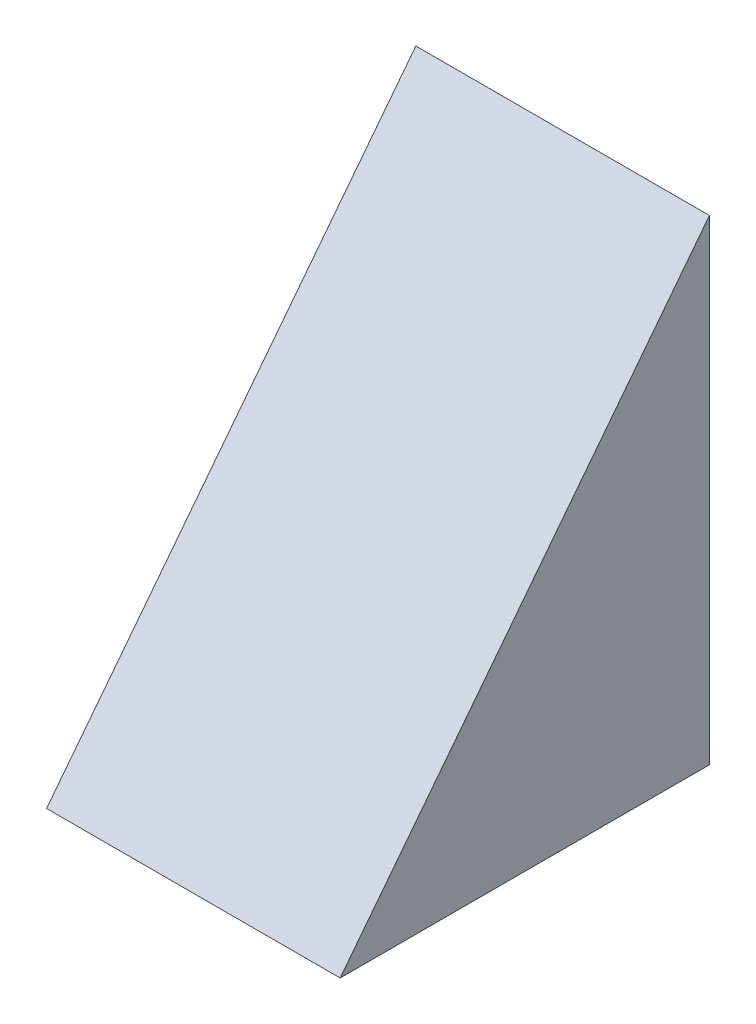
ISO-10303-21;
HEADER;
FILE_DESCRIPTION(('STEP AP214'),'2;1');
FILE_NAME('part.step','',(''),(''),'','','');
FILE_SCHEMA(('AUTOMOTIVE_DESIGN { 1 0 10303 214 1 1 1 1 }'));
ENDSEC;
DATA;
#1=APPLICATION_CONTEXT('core data for automotive mechanical design processes');
#2=APPLICATION_PROTOCOL_DEFINITION('international standard','automotive_design',2000,#1);
#3=PRODUCT_CONTEXT('',#1,'mechanical');
#4=PRODUCT('Part','Part','',(#3));
#5=PRODUCT_RELATED_PRODUCT_CATEGORY('part','',(#4));
#6=PRODUCT_DEFINITION_FORMATION('','',#4);
#7=PRODUCT_DEFINITION_CONTEXT('part definition',#1,'design');
#8=PRODUCT_DEFINITION('design','',#6,#7);
#9=PRODUCT_DEFINITION_SHAPE('','',#8);
#10=(LENGTH_UNIT() NAMED_UNIT(*) SI_UNIT(.MILLI.,.METRE.));
#11=(NAMED_UNIT(*) PLANE_ANGLE_UNIT() SI_UNIT($,.RADIAN.));
#12=(NAMED_UNIT(*) SI_UNIT($,.STERADIAN.) SOLID_ANGLE_UNIT());
#13=UNCERTAINTY_MEASURE_WITH_UNIT(LENGTH_MEASURE(1.E-05),#10,'distance_accuracy_value','');
#14=(GEOMETRIC_REPRESENTATION_CONTEXT(3) GLOBAL_UNCERTAINTY_ASSIGNED_CONTEXT((#13)) GLOBAL_UNIT_ASSIGNED_CONTEXT((#10,
#11,#12)) REPRESENTATION_CONTEXT('',''));
#15=CARTESIAN_POINT('',(0.,0.,0.));
#16=DIRECTION('',(0.,0.,1.));
#17=DIRECTION('',(1.,0.,0.));
#18=AXIS2_PLACEMENT_3D('',#15,#16,#17);
#19=CARTESIAN_POINT('',(808.42655534496,315.976,0.));
#20=DIRECTION('',(0.,-0.613184145587604,-0.78994));
#21=DIRECTION('',(0.,0.78994,-0.613184145587604));
#22=AXIS2_PLACEMENT_3D('',#19,#20,#21);
#23=PLANE('',#22);
#24=DIRECTION('',(0.,0.78994,-0.613184145587604));
#25=VECTOR('',#24,1.);
#26=CARTESIAN_POINT('',(-2.22044604925031E-13,315.976,0.));
#27=LINE('',#26,#25);
#28=CARTESIAN_POINT('',(0.,0.,245.273658235042));
#29=VERTEX_POINT('',#28);
#30=CARTESIAN_POINT('',(-2.22044604925031E-13,315.976,0.));
#31=VERTEX_POINT('',#30);
#32=EDGE_CURVE('E66',#29,#31,#27,.T.);
#33=ORIENTED_EDGE('',*,*,#32,.T.);
#34=DIRECTION('',(-1.,0.,0.));
#35=VECTOR('',#34,1.);
#36=CARTESIAN_POINT('',(-195.,315.976,0.));
#37=LINE('',#36,#35);
#38=CARTESIAN_POINT('',(-195.,315.976,0.));
#39=VERTEX_POINT('',#38);
#40=EDGE_CURVE('E80',#31,#39,#37,.T.);
#41=ORIENTED_EDGE('',*,*,#40,.T.);
#42=DIRECTION('',(0.,0.78994,-0.613184145587604));
#43=VECTOR('',#42,1.);
#44=CARTESIAN_POINT('',(-195.,315.976,0.));
#45=LINE('',#44,#43);
#46=CARTESIAN_POINT('',(-195.,0.,245.273658235042));
#47=VERTEX_POINT('',#46);
#48=EDGE_CURVE('E96',#47,#39,#45,.T.);
#49=ORIENTED_EDGE('',*,*,#48,.F.);
#50=DIRECTION('',(-1.,0.,0.));
#51=VECTOR('',#50,1.);
#52=CARTESIAN_POINT('',(808.426555344961,1.88358077888618E-13,245.273658235042));
#53=LINE('',#52,#51);
#54=EDGE_CURVE('E58',#29,#47,#53,.T.);
#55=ORIENTED_EDGE('',*,*,#54,.F.);
#56=EDGE_LOOP('',(#33,#41,#49,#55));
#57=FACE_BOUND('',#56,.T.);
#58=ADVANCED_FACE('F43',(#57),#23,.F.);
#59=CARTESIAN_POINT('',(0.,315.976,257.302));
#60=DIRECTION('',(-1.,0.,0.));
#61=DIRECTION('',(0.,-1.,0.));
#62=AXIS2_PLACEMENT_3D('',#59,#60,#61);
#63=PLANE('',#62);
#64=ORIENTED_EDGE('',*,*,#32,.F.);
#65=DIRECTION('',(0.,0.,-1.));
#66=VECTOR('',#65,1.);
#67=CARTESIAN_POINT('',(0.,0.,257.302));
#68=LINE('',#67,#66);
#69=CARTESIAN_POINT('',(0.,0.,0.));
#70=VERTEX_POINT('',#69);
#71=EDGE_CURVE('E52',#29,#70,#68,.T.);
#72=ORIENTED_EDGE('',*,*,#71,.T.);
#73=DIRECTION('',(0.,1.,0.));
#74=VECTOR('',#73,1.);
#75=CARTESIAN_POINT('',(0.,315.976,0.));
#76=LINE('',#75,#74);
#77=EDGE_CURVE('E83',#70,#31,#76,.T.);
#78=ORIENTED_EDGE('',*,*,#77,.T.);
#79=EDGE_LOOP('',(#64,#72,#78));
#80=FACE_BOUND('',#79,.T.);
#81=ADVANCED_FACE('F90',(#80),#63,.F.);
#82=CARTESIAN_POINT('',(-195.,315.976,257.302));
#83=DIRECTION('',(1.,0.,0.));
#84=DIRECTION('',(0.,1.,0.));
#85=AXIS2_PLACEMENT_3D('',#82,#83,#84);
#86=PLANE('',#85);
#87=DIRECTION('',(0.,0.,-1.));
#88=VECTOR('',#87,1.);
#89=CARTESIAN_POINT('',(-195.,0.,257.302));
#90=LINE('',#89,#88);
#91=CARTESIAN_POINT('',(-195.,0.,0.));
#92=VERTEX_POINT('',#91);
#93=EDGE_CURVE('E11',#47,#92,#90,.T.);
#94=ORIENTED_EDGE('',*,*,#93,.F.);
#95=ORIENTED_EDGE('',*,*,#48,.T.);
#96=DIRECTION('',(0.,-1.,0.));
#97=VECTOR('',#96,1.);
#98=CARTESIAN_POINT('',(-195.,315.976,0.));
#99=LINE('',#98,#97);
#100=EDGE_CURVE('E85',#39,#92,#99,.T.);
#101=ORIENTED_EDGE('',*,*,#100,.T.);
#102=EDGE_LOOP('',(#94,#95,#101));
#103=FACE_BOUND('',#102,.T.);
#104=ADVANCED_FACE('F45',(#103),#86,.F.);
#105=CARTESIAN_POINT('',(-195.,0.,257.302));
#106=DIRECTION('',(0.,1.,0.));
#107=DIRECTION('',(0.,0.,1.));
#108=AXIS2_PLACEMENT_3D('',#105,#106,#107);
#109=PLANE('',#108);
#110=ORIENTED_EDGE('',*,*,#71,.F.);
#111=ORIENTED_EDGE('',*,*,#54,.T.);
#112=ORIENTED_EDGE('',*,*,#93,.T.);
#113=DIRECTION('',(1.,0.,0.));
#114=VECTOR('',#113,1.);
#115=CARTESIAN_POINT('',(-195.,0.,0.));
#116=LINE('',#115,#114);
#117=EDGE_CURVE('E93',#92,#70,#116,.T.);
#118=ORIENTED_EDGE('',*,*,#117,.T.);
#119=EDGE_LOOP('',(#110,#111,#112,#118));
#120=FACE_BOUND('',#119,.T.);
#121=ADVANCED_FACE('F107',(#120),#109,.F.);
#122=CARTESIAN_POINT('',(0.,0.,0.));
#123=DIRECTION('',(0.,0.,1.));
#124=DIRECTION('',(1.,0.,0.));
#125=AXIS2_PLACEMENT_3D('',#122,#123,#124);
#126=PLANE('',#125);
#127=ORIENTED_EDGE('',*,*,#100,.F.);
#128=ORIENTED_EDGE('',*,*,#40,.F.);
#129=ORIENTED_EDGE('',*,*,#77,.F.);
#130=ORIENTED_EDGE('',*,*,#117,.F.);
#131=EDGE_LOOP('',(#127,#128,#129,#130));
#132=FACE_BOUND('',#131,.T.);
#133=ADVANCED_FACE('F81',(#132),#126,.F.);
#134=CLOSED_SHELL('',(#58,#81,#104,#121,#133));
#135=MANIFOLD_SOLID_BREP('B2',#134);
#136=ADVANCED_BREP_SHAPE_REPRESENTATION('',(#18,#135),#14);
#137=SHAPE_DEFINITION_REPRESENTATION(#9,#136);
ENDSEC;
END-ISO-10303-21;
